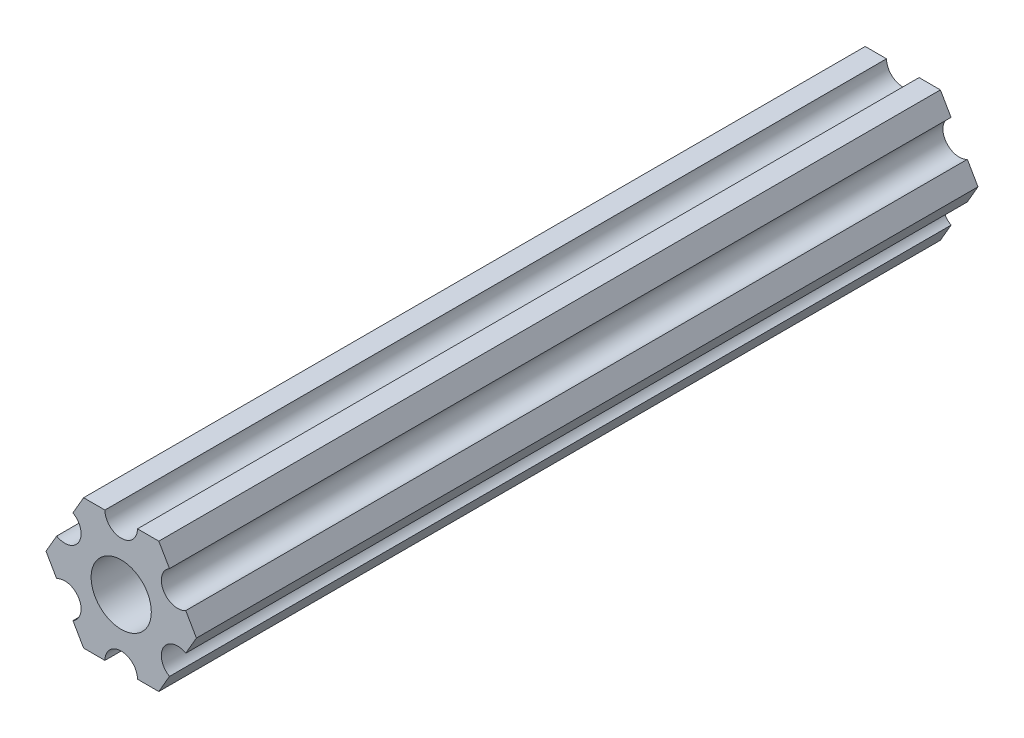
ISO-10303-21;
HEADER;
FILE_DESCRIPTION(('STEP AP214'),'2;1');
FILE_NAME('part.step','',(''),(''),'','','');
FILE_SCHEMA(('AUTOMOTIVE_DESIGN { 1 0 10303 214 1 1 1 1 }'));
ENDSEC;
DATA;
#1=APPLICATION_CONTEXT('core data for automotive mechanical design processes');
#2=APPLICATION_PROTOCOL_DEFINITION('international standard','automotive_design',2000,#1);
#3=PRODUCT_CONTEXT('',#1,'mechanical');
#4=PRODUCT('Part','Part','',(#3));
#5=PRODUCT_RELATED_PRODUCT_CATEGORY('part','',(#4));
#6=PRODUCT_DEFINITION_FORMATION('','',#4);
#7=PRODUCT_DEFINITION_CONTEXT('part definition',#1,'design');
#8=PRODUCT_DEFINITION('design','',#6,#7);
#9=PRODUCT_DEFINITION_SHAPE('','',#8);
#10=(LENGTH_UNIT() NAMED_UNIT(*) SI_UNIT(.MILLI.,.METRE.));
#11=(NAMED_UNIT(*) PLANE_ANGLE_UNIT() SI_UNIT($,.RADIAN.));
#12=(NAMED_UNIT(*) SI_UNIT($,.STERADIAN.) SOLID_ANGLE_UNIT());
#13=UNCERTAINTY_MEASURE_WITH_UNIT(LENGTH_MEASURE(1.E-05),#10,'distance_accuracy_value','');
#14=(GEOMETRIC_REPRESENTATION_CONTEXT(3) GLOBAL_UNCERTAINTY_ASSIGNED_CONTEXT((#13)) GLOBAL_UNIT_ASSIGNED_CONTEXT((#10,
#11,#12)) REPRESENTATION_CONTEXT('',''));
#15=CARTESIAN_POINT('',(0.,0.,0.));
#16=DIRECTION('',(0.,0.,1.));
#17=DIRECTION('',(1.,0.,0.));
#18=AXIS2_PLACEMENT_3D('',#15,#16,#17);
#19=CARTESIAN_POINT('',(5.49926150638083,-3.17499966684068,-76.2));
#20=DIRECTION('',(0.,0.,1.));
#21=DIRECTION('',(1.,0.,0.));
#22=AXIS2_PLACEMENT_3D('',#19,#20,#21);
#23=PLANE('',#22);
#24=CARTESIAN_POINT('',(5.49926150638083,-3.17499966684068,-76.2));
#25=DIRECTION('',(0.,0.,1.));
#26=DIRECTION('',(1.,0.,0.));
#27=AXIS2_PLACEMENT_3D('',#24,#25,#26);
#28=CIRCLE('',#27,1.58750000000001);
#29=CARTESIAN_POINT('',(6.29301142309098,-1.80018429024546,-76.2));
#30=VERTEX_POINT('',#29);
#31=CARTESIAN_POINT('',(4.70551158967068,-4.54981504343589,-76.2));
#32=VERTEX_POINT('',#31);
#33=EDGE_CURVE('E227',#30,#32,#28,.T.);
#34=ORIENTED_EDGE('',*,*,#33,.T.);
#35=DIRECTION('',(-0.499999947533953,-0.866025434075723,0.));
#36=VECTOR('',#35,1.);
#37=CARTESIAN_POINT('',(4.70551158967068,-4.54981504343589,-76.2));
#38=LINE('',#37,#36);
#39=CARTESIAN_POINT('',(3.66617452134693,-6.34999990382519,-76.2));
#40=VERTEX_POINT('',#39);
#41=EDGE_CURVE('E125',#32,#40,#38,.T.);
#42=ORIENTED_EDGE('',*,*,#41,.T.);
#43=DIRECTION('',(-1.,0.,0.));
#44=VECTOR('',#43,1.);
#45=CARTESIAN_POINT('',(3.66617452134693,-6.34999990382519,-76.2));
#46=LINE('',#45,#44);
#47=CARTESIAN_POINT('',(1.58750038469926,-6.34999990382518,-76.2));
#48=VERTEX_POINT('',#47);
#49=EDGE_CURVE('E272',#40,#48,#46,.T.);
#50=ORIENTED_EDGE('',*,*,#49,.T.);
#51=CARTESIAN_POINT('',(3.8469926204343E-07,-6.34999990382519,-76.2));
#52=DIRECTION('',(0.,0.,1.));
#53=DIRECTION('',(1.,0.,0.));
#54=AXIS2_PLACEMENT_3D('',#51,#52,#53);
#55=CIRCLE('',#54,1.5875);
#56=CARTESIAN_POINT('',(-1.58749961530074,-6.34999990382519,-76.2));
#57=VERTEX_POINT('',#56);
#58=EDGE_CURVE('E291',#48,#57,#55,.T.);
#59=ORIENTED_EDGE('',*,*,#58,.T.);
#60=DIRECTION('',(-1.,0.,0.));
#61=VECTOR('',#60,1.);
#62=CARTESIAN_POINT('',(-1.58749961530074,-6.34999990382519,-76.2));
#63=LINE('',#62,#61);
#64=CARTESIAN_POINT('',(-3.66617382465481,-6.34999990382519,-76.2));
#65=VERTEX_POINT('',#64);
#66=EDGE_CURVE('E288',#57,#65,#63,.T.);
#67=ORIENTED_EDGE('',*,*,#66,.T.);
#68=DIRECTION('',(-0.500000006198653,0.866025400205644,0.));
#69=VECTOR('',#68,1.);
#70=CARTESIAN_POINT('',(-3.66617382465481,-6.34999990382519,-76.2));
#71=LINE('',#70,#69);
#72=CARTESIAN_POINT('',(-4.70551094221689,-4.54981523977206,-76.2));
#73=VERTEX_POINT('',#72);
#74=EDGE_CURVE('E290',#65,#73,#71,.T.);
#75=ORIENTED_EDGE('',*,*,#74,.T.);
#76=CARTESIAN_POINT('',(-5.49926095205725,-3.1749999169456,-76.2));
#77=DIRECTION('',(0.,0.,1.));
#78=DIRECTION('',(1.,0.,0.));
#79=AXIS2_PLACEMENT_3D('',#76,#77,#78);
#80=CIRCLE('',#79,1.5875);
#81=CARTESIAN_POINT('',(-6.29301096189761,-1.80018459411914,-76.2));
#82=VERTEX_POINT('',#81);
#83=EDGE_CURVE('E293',#73,#82,#80,.T.);
#84=ORIENTED_EDGE('',*,*,#83,.T.);
#85=DIRECTION('',(-0.500000006198653,0.866025400205645,0.));
#86=VECTOR('',#85,1.);
#87=CARTESIAN_POINT('',(-6.29301096189761,-1.80018459411914,-76.2));
#88=LINE('',#87,#86);
#89=CARTESIAN_POINT('',(-7.33234807945963,6.99338729030344E-08,-76.2));
#90=VERTEX_POINT('',#89);
#91=EDGE_CURVE('E299',#82,#90,#88,.T.);
#92=ORIENTED_EDGE('',*,*,#91,.T.);
#93=DIRECTION('',(0.499999924400249,0.866025447431971,0.));
#94=VECTOR('',#93,1.);
#95=CARTESIAN_POINT('',(-7.33234807945963,6.99338729030344E-08,-76.2));
#96=LINE('',#95,#94);
#97=CARTESIAN_POINT('',(-6.29301121674195,1.80018468525613,-76.2));
#98=VERTEX_POINT('',#97);
#99=EDGE_CURVE('E301',#90,#98,#96,.T.);
#100=ORIENTED_EDGE('',*,*,#99,.T.);
#101=CARTESIAN_POINT('',(-5.49926133675655,3.17500008305439,-76.2));
#102=DIRECTION('',(0.,0.,1.));
#103=DIRECTION('',(1.,0.,0.));
#104=AXIS2_PLACEMENT_3D('',#101,#102,#103);
#105=CIRCLE('',#104,1.5875);
#106=CARTESIAN_POINT('',(-4.70551145677116,4.54981548085265,-76.2));
#107=VERTEX_POINT('',#106);
#108=EDGE_CURVE('E303',#98,#107,#105,.T.);
#109=ORIENTED_EDGE('',*,*,#108,.T.);
#110=DIRECTION('',(0.499999924400249,0.866025447431971,0.));
#111=VECTOR('',#110,1.);
#112=CARTESIAN_POINT('',(-4.70551145677116,4.54981548085265,-76.2));
#113=LINE('',#112,#111);
#114=CARTESIAN_POINT('',(-3.66617452134701,6.35000022210623,-76.2));
#115=VERTEX_POINT('',#114);
#116=EDGE_CURVE('E305',#107,#115,#113,.T.);
#117=ORIENTED_EDGE('',*,*,#116,.T.);
#118=DIRECTION('',(1.,0.,0.));
#119=VECTOR('',#118,1.);
#120=CARTESIAN_POINT('',(-3.66617452134701,6.35000022210623,-76.2));
#121=LINE('',#120,#119);
#122=CARTESIAN_POINT('',(-1.58750038469935,6.35000022210623,-76.2));
#123=VERTEX_POINT('',#122);
#124=EDGE_CURVE('E307',#115,#123,#121,.T.);
#125=ORIENTED_EDGE('',*,*,#124,.T.);
#126=CARTESIAN_POINT('',(-3.84699344941095E-07,6.35000022210623,-76.2));
#127=DIRECTION('',(0.,0.,1.));
#128=DIRECTION('',(1.,0.,0.));
#129=AXIS2_PLACEMENT_3D('',#126,#127,#128);
#130=CIRCLE('',#129,1.5875);
#131=CARTESIAN_POINT('',(1.58749961530066,6.35000022210623,-76.2));
#132=VERTEX_POINT('',#131);
#133=EDGE_CURVE('E309',#123,#132,#130,.T.);
#134=ORIENTED_EDGE('',*,*,#133,.T.);
#135=DIRECTION('',(1.,0.,0.));
#136=VECTOR('',#135,1.);
#137=CARTESIAN_POINT('',(1.58749961530066,6.35000022210623,-76.2));
#138=LINE('',#137,#136);
#139=CARTESIAN_POINT('',(3.66617382465472,6.35000022210622,-76.2));
#140=VERTEX_POINT('',#139);
#141=EDGE_CURVE('E311',#132,#140,#138,.T.);
#142=ORIENTED_EDGE('',*,*,#141,.T.);
#143=DIRECTION('',(0.500000052466056,-0.866025373493145,0.));
#144=VECTOR('',#143,1.);
#145=CARTESIAN_POINT('',(3.66617382465472,6.35000022210622,-76.2));
#146=LINE('',#145,#144);
#147=CARTESIAN_POINT('',(4.70551103839166,4.54981561357968,-76.2));
#148=VERTEX_POINT('',#147);
#149=EDGE_CURVE('E174',#140,#148,#146,.T.);
#150=ORIENTED_EDGE('',*,*,#149,.T.);
#151=CARTESIAN_POINT('',(5.49926112168152,3.17500033315931,-76.2));
#152=DIRECTION('',(0.,0.,1.));
#153=DIRECTION('',(1.,0.,0.));
#154=AXIS2_PLACEMENT_3D('',#151,#152,#153);
#155=CIRCLE('',#154,1.5875);
#156=CARTESIAN_POINT('',(6.29301120497139,1.80018505273895,-76.2));
#157=VERTEX_POINT('',#156);
#158=EDGE_CURVE('E168',#148,#157,#155,.T.);
#159=ORIENTED_EDGE('',*,*,#158,.T.);
#160=DIRECTION('',(0.500000052466056,-0.866025373493145,0.));
#161=VECTOR('',#160,1.);
#162=CARTESIAN_POINT('',(6.29301120497139,1.80018505273895,-76.2));
#163=LINE('',#162,#161);
#164=CARTESIAN_POINT('',(7.33234841870826,4.44212518856872E-07,-76.2));
#165=VERTEX_POINT('',#164);
#166=EDGE_CURVE('E172',#157,#165,#163,.T.);
#167=ORIENTED_EDGE('',*,*,#166,.T.);
#168=DIRECTION('',(-0.499999947533953,-0.866025434075723,0.));
#169=VECTOR('',#168,1.);
#170=CARTESIAN_POINT('',(7.33234841870826,4.44212518856872E-07,-76.2));
#171=LINE('',#170,#169);
#172=EDGE_CURVE('E52',#165,#30,#171,.T.);
#173=ORIENTED_EDGE('',*,*,#172,.T.);
#174=EDGE_LOOP('',(#34,#42,#50,#59,#67,#75,#84,#92,#100,#109,#117,#125,#134,#142,#150,#159,#167,#173));
#175=FACE_BOUND('',#174,.T.);
#176=CARTESIAN_POINT('',(0.,0.,-76.2));
#177=DIRECTION('',(0.,0.,-1.));
#178=DIRECTION('',(1.,0.,0.));
#179=AXIS2_PLACEMENT_3D('',#176,#177,#178);
#180=CIRCLE('',#179,2.9337);
#181=CARTESIAN_POINT('',(2.9337,0.,-76.2));
#182=VERTEX_POINT('',#181);
#183=EDGE_CURVE('E196',#182,#182,#180,.T.);
#184=ORIENTED_EDGE('',*,*,#183,.F.);
#185=EDGE_LOOP('',(#184));
#186=FACE_BOUND('',#185,.T.);
#187=ADVANCED_FACE('F35',(#175,#186),#23,.F.);
#188=CARTESIAN_POINT('',(5.49926150638083,-3.17499966684068,0.));
#189=DIRECTION('',(0.,0.,1.));
#190=DIRECTION('',(1.,0.,0.));
#191=AXIS2_PLACEMENT_3D('',#188,#189,#190);
#192=PLANE('',#191);
#193=CARTESIAN_POINT('',(5.49926150638083,-3.17499966684068,0.));
#194=DIRECTION('',(0.,0.,1.));
#195=DIRECTION('',(1.,0.,0.));
#196=AXIS2_PLACEMENT_3D('',#193,#194,#195);
#197=CIRCLE('',#196,1.58750000000001);
#198=CARTESIAN_POINT('',(6.29301142309098,-1.80018429024546,0.));
#199=VERTEX_POINT('',#198);
#200=CARTESIAN_POINT('',(4.70551158967068,-4.54981504343589,0.));
#201=VERTEX_POINT('',#200);
#202=EDGE_CURVE('E192',#199,#201,#197,.T.);
#203=ORIENTED_EDGE('',*,*,#202,.F.);
#204=DIRECTION('',(-0.499999947533953,-0.866025434075723,0.));
#205=VECTOR('',#204,1.);
#206=CARTESIAN_POINT('',(7.33234841870826,4.44212518856872E-07,0.));
#207=LINE('',#206,#205);
#208=CARTESIAN_POINT('',(7.33234841870826,4.44212518856872E-07,0.));
#209=VERTEX_POINT('',#208);
#210=EDGE_CURVE('E117',#209,#199,#207,.T.);
#211=ORIENTED_EDGE('',*,*,#210,.F.);
#212=DIRECTION('',(0.500000052466056,-0.866025373493145,0.));
#213=VECTOR('',#212,1.);
#214=CARTESIAN_POINT('',(6.29301120497139,1.80018505273895,0.));
#215=LINE('',#214,#213);
#216=CARTESIAN_POINT('',(6.29301120497139,1.80018505273895,0.));
#217=VERTEX_POINT('',#216);
#218=EDGE_CURVE('E111',#217,#209,#215,.T.);
#219=ORIENTED_EDGE('',*,*,#218,.F.);
#220=CARTESIAN_POINT('',(5.49926112168152,3.17500033315931,0.));
#221=DIRECTION('',(0.,0.,1.));
#222=DIRECTION('',(1.,0.,0.));
#223=AXIS2_PLACEMENT_3D('',#220,#221,#222);
#224=CIRCLE('',#223,1.5875);
#225=CARTESIAN_POINT('',(4.70551103839166,4.54981561357968,0.));
#226=VERTEX_POINT('',#225);
#227=EDGE_CURVE('E182',#226,#217,#224,.T.);
#228=ORIENTED_EDGE('',*,*,#227,.F.);
#229=DIRECTION('',(0.500000052466056,-0.866025373493145,0.));
#230=VECTOR('',#229,1.);
#231=CARTESIAN_POINT('',(3.66617382465472,6.35000022210622,0.));
#232=LINE('',#231,#230);
#233=CARTESIAN_POINT('',(3.66617382465472,6.35000022210622,0.));
#234=VERTEX_POINT('',#233);
#235=EDGE_CURVE('E222',#234,#226,#232,.T.);
#236=ORIENTED_EDGE('',*,*,#235,.F.);
#237=DIRECTION('',(1.,0.,0.));
#238=VECTOR('',#237,1.);
#239=CARTESIAN_POINT('',(1.58749961530066,6.35000022210623,0.));
#240=LINE('',#239,#238);
#241=CARTESIAN_POINT('',(1.58749961530066,6.35000022210623,0.));
#242=VERTEX_POINT('',#241);
#243=EDGE_CURVE('E220',#242,#234,#240,.T.);
#244=ORIENTED_EDGE('',*,*,#243,.F.);
#245=CARTESIAN_POINT('',(-3.84699344941095E-07,6.35000022210623,0.));
#246=DIRECTION('',(0.,0.,1.));
#247=DIRECTION('',(1.,0.,0.));
#248=AXIS2_PLACEMENT_3D('',#245,#246,#247);
#249=CIRCLE('',#248,1.5875);
#250=CARTESIAN_POINT('',(-1.58750038469935,6.35000022210623,0.));
#251=VERTEX_POINT('',#250);
#252=EDGE_CURVE('E218',#251,#242,#249,.T.);
#253=ORIENTED_EDGE('',*,*,#252,.F.);
#254=DIRECTION('',(1.,0.,0.));
#255=VECTOR('',#254,1.);
#256=CARTESIAN_POINT('',(-3.66617452134701,6.35000022210623,0.));
#257=LINE('',#256,#255);
#258=CARTESIAN_POINT('',(-3.66617452134701,6.35000022210623,0.));
#259=VERTEX_POINT('',#258);
#260=EDGE_CURVE('E216',#259,#251,#257,.T.);
#261=ORIENTED_EDGE('',*,*,#260,.F.);
#262=DIRECTION('',(0.499999924400249,0.866025447431971,0.));
#263=VECTOR('',#262,1.);
#264=CARTESIAN_POINT('',(-4.70551145677116,4.54981548085265,0.));
#265=LINE('',#264,#263);
#266=CARTESIAN_POINT('',(-4.70551145677116,4.54981548085265,0.));
#267=VERTEX_POINT('',#266);
#268=EDGE_CURVE('E214',#267,#259,#265,.T.);
#269=ORIENTED_EDGE('',*,*,#268,.F.);
#270=CARTESIAN_POINT('',(-5.49926133675655,3.17500008305439,0.));
#271=DIRECTION('',(0.,0.,1.));
#272=DIRECTION('',(1.,0.,0.));
#273=AXIS2_PLACEMENT_3D('',#270,#271,#272);
#274=CIRCLE('',#273,1.5875);
#275=CARTESIAN_POINT('',(-6.29301121674195,1.80018468525613,0.));
#276=VERTEX_POINT('',#275);
#277=EDGE_CURVE('E212',#276,#267,#274,.T.);
#278=ORIENTED_EDGE('',*,*,#277,.F.);
#279=DIRECTION('',(0.499999924400249,0.866025447431971,0.));
#280=VECTOR('',#279,1.);
#281=CARTESIAN_POINT('',(-7.33234807945963,6.99338729030344E-08,0.));
#282=LINE('',#281,#280);
#283=CARTESIAN_POINT('',(-7.33234807945963,6.99338729030344E-08,0.));
#284=VERTEX_POINT('',#283);
#285=EDGE_CURVE('E210',#284,#276,#282,.T.);
#286=ORIENTED_EDGE('',*,*,#285,.F.);
#287=DIRECTION('',(-0.500000006198653,0.866025400205645,0.));
#288=VECTOR('',#287,1.);
#289=CARTESIAN_POINT('',(-6.29301096189761,-1.80018459411914,0.));
#290=LINE('',#289,#288);
#291=CARTESIAN_POINT('',(-6.29301096189761,-1.80018459411914,0.));
#292=VERTEX_POINT('',#291);
#293=EDGE_CURVE('E208',#292,#284,#290,.T.);
#294=ORIENTED_EDGE('',*,*,#293,.F.);
#295=CARTESIAN_POINT('',(-5.49926095205725,-3.1749999169456,0.));
#296=DIRECTION('',(0.,0.,1.));
#297=DIRECTION('',(1.,0.,0.));
#298=AXIS2_PLACEMENT_3D('',#295,#296,#297);
#299=CIRCLE('',#298,1.5875);
#300=CARTESIAN_POINT('',(-4.70551094221689,-4.54981523977206,0.));
#301=VERTEX_POINT('',#300);
#302=EDGE_CURVE('E206',#301,#292,#299,.T.);
#303=ORIENTED_EDGE('',*,*,#302,.F.);
#304=DIRECTION('',(-0.500000006198653,0.866025400205644,0.));
#305=VECTOR('',#304,1.);
#306=CARTESIAN_POINT('',(-3.66617382465481,-6.34999990382519,0.));
#307=LINE('',#306,#305);
#308=CARTESIAN_POINT('',(-3.66617382465481,-6.34999990382519,0.));
#309=VERTEX_POINT('',#308);
#310=EDGE_CURVE('E204',#309,#301,#307,.T.);
#311=ORIENTED_EDGE('',*,*,#310,.F.);
#312=DIRECTION('',(-1.,0.,0.));
#313=VECTOR('',#312,1.);
#314=CARTESIAN_POINT('',(-1.58749961530074,-6.34999990382519,0.));
#315=LINE('',#314,#313);
#316=CARTESIAN_POINT('',(-1.58749961530074,-6.34999990382519,0.));
#317=VERTEX_POINT('',#316);
#318=EDGE_CURVE('E202',#317,#309,#315,.T.);
#319=ORIENTED_EDGE('',*,*,#318,.F.);
#320=CARTESIAN_POINT('',(3.8469926204343E-07,-6.34999990382519,0.));
#321=DIRECTION('',(0.,0.,1.));
#322=DIRECTION('',(1.,0.,0.));
#323=AXIS2_PLACEMENT_3D('',#320,#321,#322);
#324=CIRCLE('',#323,1.5875);
#325=CARTESIAN_POINT('',(1.58750038469926,-6.34999990382518,0.));
#326=VERTEX_POINT('',#325);
#327=EDGE_CURVE('E200',#326,#317,#324,.T.);
#328=ORIENTED_EDGE('',*,*,#327,.F.);
#329=DIRECTION('',(-1.,0.,0.));
#330=VECTOR('',#329,1.);
#331=CARTESIAN_POINT('',(3.66617452134693,-6.34999990382519,0.));
#332=LINE('',#331,#330);
#333=CARTESIAN_POINT('',(3.66617452134693,-6.34999990382519,0.));
#334=VERTEX_POINT('',#333);
#335=EDGE_CURVE('E198',#334,#326,#332,.T.);
#336=ORIENTED_EDGE('',*,*,#335,.F.);
#337=DIRECTION('',(-0.499999947533953,-0.866025434075723,0.));
#338=VECTOR('',#337,1.);
#339=CARTESIAN_POINT('',(4.70551158967068,-4.54981504343589,0.));
#340=LINE('',#339,#338);
#341=EDGE_CURVE('E195',#201,#334,#340,.T.);
#342=ORIENTED_EDGE('',*,*,#341,.F.);
#343=EDGE_LOOP('',(#203,#211,#219,#228,#236,#244,#253,#261,#269,#278,#286,#294,#303,#311,#319,
#328,#336,#342));
#344=FACE_BOUND('',#343,.T.);
#345=CARTESIAN_POINT('',(0.,0.,0.));
#346=DIRECTION('',(0.,0.,-1.));
#347=DIRECTION('',(1.,0.,0.));
#348=AXIS2_PLACEMENT_3D('',#345,#346,#347);
#349=CIRCLE('',#348,2.9337);
#350=CARTESIAN_POINT('',(2.9337,0.,0.));
#351=VERTEX_POINT('',#350);
#352=EDGE_CURVE('E536',#351,#351,#349,.T.);
#353=ORIENTED_EDGE('',*,*,#352,.T.);
#354=EDGE_LOOP('',(#353));
#355=FACE_BOUND('',#354,.T.);
#356=ADVANCED_FACE('F276',(#344,#355),#192,.T.);
#357=CARTESIAN_POINT('',(5.49926150638083,-3.17499966684068,-76.2));
#358=DIRECTION('',(0.,0.,1.));
#359=DIRECTION('',(1.,0.,0.));
#360=AXIS2_PLACEMENT_3D('',#357,#358,#359);
#361=CYLINDRICAL_SURFACE('',#360,1.58750000000001);
#362=ORIENTED_EDGE('',*,*,#202,.T.);
#363=DIRECTION('',(0.,0.,1.));
#364=VECTOR('',#363,1.);
#365=CARTESIAN_POINT('',(4.70551158967068,-4.54981504343589,-76.2));
#366=LINE('',#365,#364);
#367=EDGE_CURVE('E11',#32,#201,#366,.T.);
#368=ORIENTED_EDGE('',*,*,#367,.F.);
#369=ORIENTED_EDGE('',*,*,#33,.F.);
#370=DIRECTION('',(0.,0.,1.));
#371=VECTOR('',#370,1.);
#372=CARTESIAN_POINT('',(6.29301142309098,-1.80018429024546,-76.2));
#373=LINE('',#372,#371);
#374=EDGE_CURVE('E188',#30,#199,#373,.T.);
#375=ORIENTED_EDGE('',*,*,#374,.T.);
#376=EDGE_LOOP('',(#362,#368,#369,#375));
#377=FACE_BOUND('',#376,.T.);
#378=ADVANCED_FACE('F37',(#377),#361,.F.);
#379=CARTESIAN_POINT('',(4.70551158967068,-4.54981504343589,-76.2));
#380=DIRECTION('',(-0.866025434075723,0.499999947533953,0.));
#381=DIRECTION('',(-0.499999947533953,-0.866025434075723,0.));
#382=AXIS2_PLACEMENT_3D('',#379,#380,#381);
#383=PLANE('',#382);
#384=ORIENTED_EDGE('',*,*,#341,.T.);
#385=DIRECTION('',(0.,0.,1.));
#386=VECTOR('',#385,1.);
#387=CARTESIAN_POINT('',(3.66617452134693,-6.34999990382519,-76.2));
#388=LINE('',#387,#386);
#389=EDGE_CURVE('E44',#40,#334,#388,.T.);
#390=ORIENTED_EDGE('',*,*,#389,.F.);
#391=ORIENTED_EDGE('',*,*,#41,.F.);
#392=ORIENTED_EDGE('',*,*,#367,.T.);
#393=EDGE_LOOP('',(#384,#390,#391,#392));
#394=FACE_BOUND('',#393,.T.);
#395=ADVANCED_FACE('F345',(#394),#383,.F.);
#396=CARTESIAN_POINT('',(3.66617452134693,-6.34999990382519,-76.2));
#397=DIRECTION('',(0.,1.,0.));
#398=DIRECTION('',(-1.,0.,0.));
#399=AXIS2_PLACEMENT_3D('',#396,#397,#398);
#400=PLANE('',#399);
#401=ORIENTED_EDGE('',*,*,#335,.T.);
#402=DIRECTION('',(0.,0.,1.));
#403=VECTOR('',#402,1.);
#404=CARTESIAN_POINT('',(1.58750038469926,-6.34999990382518,-76.2));
#405=LINE('',#404,#403);
#406=EDGE_CURVE('E264',#48,#326,#405,.T.);
#407=ORIENTED_EDGE('',*,*,#406,.F.);
#408=ORIENTED_EDGE('',*,*,#49,.F.);
#409=ORIENTED_EDGE('',*,*,#389,.T.);
#410=EDGE_LOOP('',(#401,#407,#408,#409));
#411=FACE_BOUND('',#410,.T.);
#412=ADVANCED_FACE('F270',(#411),#400,.F.);
#413=CARTESIAN_POINT('',(3.8469926204343E-07,-6.34999990382519,-76.2));
#414=DIRECTION('',(0.,0.,1.));
#415=DIRECTION('',(1.,0.,0.));
#416=AXIS2_PLACEMENT_3D('',#413,#414,#415);
#417=CYLINDRICAL_SURFACE('',#416,1.5875);
#418=ORIENTED_EDGE('',*,*,#327,.T.);
#419=DIRECTION('',(0.,0.,1.));
#420=VECTOR('',#419,1.);
#421=CARTESIAN_POINT('',(-1.58749961530074,-6.34999990382519,-76.2));
#422=LINE('',#421,#420);
#423=EDGE_CURVE('E261',#57,#317,#422,.T.);
#424=ORIENTED_EDGE('',*,*,#423,.F.);
#425=ORIENTED_EDGE('',*,*,#58,.F.);
#426=ORIENTED_EDGE('',*,*,#406,.T.);
#427=EDGE_LOOP('',(#418,#424,#425,#426));
#428=FACE_BOUND('',#427,.T.);
#429=ADVANCED_FACE('F282',(#428),#417,.F.);
#430=CARTESIAN_POINT('',(-1.58749961530074,-6.34999990382519,-76.2));
#431=DIRECTION('',(0.,1.,0.));
#432=DIRECTION('',(-1.,0.,0.));
#433=AXIS2_PLACEMENT_3D('',#430,#431,#432);
#434=PLANE('',#433);
#435=ORIENTED_EDGE('',*,*,#318,.T.);
#436=DIRECTION('',(0.,0.,1.));
#437=VECTOR('',#436,1.);
#438=CARTESIAN_POINT('',(-3.66617382465481,-6.34999990382519,-76.2));
#439=LINE('',#438,#437);
#440=EDGE_CURVE('E258',#65,#309,#439,.T.);
#441=ORIENTED_EDGE('',*,*,#440,.F.);
#442=ORIENTED_EDGE('',*,*,#66,.F.);
#443=ORIENTED_EDGE('',*,*,#423,.T.);
#444=EDGE_LOOP('',(#435,#441,#442,#443));
#445=FACE_BOUND('',#444,.T.);
#446=ADVANCED_FACE('F286',(#445),#434,.F.);
#447=CARTESIAN_POINT('',(-3.66617382465481,-6.34999990382519,-76.2));
#448=DIRECTION('',(0.866025400205645,0.500000006198653,0.));
#449=DIRECTION('',(-0.500000006198653,0.866025400205645,0.));
#450=AXIS2_PLACEMENT_3D('',#447,#448,#449);
#451=PLANE('',#450);
#452=ORIENTED_EDGE('',*,*,#310,.T.);
#453=DIRECTION('',(0.,0.,1.));
#454=VECTOR('',#453,1.);
#455=CARTESIAN_POINT('',(-4.70551094221689,-4.54981523977206,-76.2));
#456=LINE('',#455,#454);
#457=EDGE_CURVE('E255',#73,#301,#456,.T.);
#458=ORIENTED_EDGE('',*,*,#457,.F.);
#459=ORIENTED_EDGE('',*,*,#74,.F.);
#460=ORIENTED_EDGE('',*,*,#440,.T.);
#461=EDGE_LOOP('',(#452,#458,#459,#460));
#462=FACE_BOUND('',#461,.T.);
#463=ADVANCED_FACE('F358',(#462),#451,.F.);
#464=CARTESIAN_POINT('',(-5.49926095205725,-3.1749999169456,-76.2));
#465=DIRECTION('',(0.,0.,1.));
#466=DIRECTION('',(1.,0.,0.));
#467=AXIS2_PLACEMENT_3D('',#464,#465,#466);
#468=CYLINDRICAL_SURFACE('',#467,1.5875);
#469=ORIENTED_EDGE('',*,*,#302,.T.);
#470=DIRECTION('',(0.,0.,1.));
#471=VECTOR('',#470,1.);
#472=CARTESIAN_POINT('',(-6.29301096189761,-1.80018459411914,-76.2));
#473=LINE('',#472,#471);
#474=EDGE_CURVE('E252',#82,#292,#473,.T.);
#475=ORIENTED_EDGE('',*,*,#474,.F.);
#476=ORIENTED_EDGE('',*,*,#83,.F.);
#477=ORIENTED_EDGE('',*,*,#457,.T.);
#478=EDGE_LOOP('',(#469,#475,#476,#477));
#479=FACE_BOUND('',#478,.T.);
#480=ADVANCED_FACE('F361',(#479),#468,.F.);
#481=CARTESIAN_POINT('',(-6.29301096189761,-1.80018459411914,-76.2));
#482=DIRECTION('',(0.866025400205645,0.500000006198653,0.));
#483=DIRECTION('',(-0.500000006198653,0.866025400205645,0.));
#484=AXIS2_PLACEMENT_3D('',#481,#482,#483);
#485=PLANE('',#484);
#486=ORIENTED_EDGE('',*,*,#293,.T.);
#487=DIRECTION('',(0.,0.,1.));
#488=VECTOR('',#487,1.);
#489=CARTESIAN_POINT('',(-7.33234807945963,6.99338729030344E-08,-76.2));
#490=LINE('',#489,#488);
#491=EDGE_CURVE('E249',#90,#284,#490,.T.);
#492=ORIENTED_EDGE('',*,*,#491,.F.);
#493=ORIENTED_EDGE('',*,*,#91,.F.);
#494=ORIENTED_EDGE('',*,*,#474,.T.);
#495=EDGE_LOOP('',(#486,#492,#493,#494));
#496=FACE_BOUND('',#495,.T.);
#497=ADVANCED_FACE('F365',(#496),#485,.F.);
#498=CARTESIAN_POINT('',(-7.33234807945963,6.99338729030344E-08,-76.2));
#499=DIRECTION('',(0.866025447431971,-0.499999924400249,0.));
#500=DIRECTION('',(0.499999924400249,0.866025447431971,0.));
#501=AXIS2_PLACEMENT_3D('',#498,#499,#500);
#502=PLANE('',#501);
#503=ORIENTED_EDGE('',*,*,#285,.T.);
#504=DIRECTION('',(0.,0.,1.));
#505=VECTOR('',#504,1.);
#506=CARTESIAN_POINT('',(-6.29301121674195,1.80018468525613,-76.2));
#507=LINE('',#506,#505);
#508=EDGE_CURVE('E246',#98,#276,#507,.T.);
#509=ORIENTED_EDGE('',*,*,#508,.F.);
#510=ORIENTED_EDGE('',*,*,#99,.F.);
#511=ORIENTED_EDGE('',*,*,#491,.T.);
#512=EDGE_LOOP('',(#503,#509,#510,#511));
#513=FACE_BOUND('',#512,.T.);
#514=ADVANCED_FACE('F369',(#513),#502,.F.);
#515=CARTESIAN_POINT('',(-5.49926133675655,3.17500008305439,-76.2));
#516=DIRECTION('',(0.,0.,1.));
#517=DIRECTION('',(1.,0.,0.));
#518=AXIS2_PLACEMENT_3D('',#515,#516,#517);
#519=CYLINDRICAL_SURFACE('',#518,1.5875);
#520=ORIENTED_EDGE('',*,*,#277,.T.);
#521=DIRECTION('',(0.,0.,1.));
#522=VECTOR('',#521,1.);
#523=CARTESIAN_POINT('',(-4.70551145677116,4.54981548085265,-76.2));
#524=LINE('',#523,#522);
#525=EDGE_CURVE('E243',#107,#267,#524,.T.);
#526=ORIENTED_EDGE('',*,*,#525,.F.);
#527=ORIENTED_EDGE('',*,*,#108,.F.);
#528=ORIENTED_EDGE('',*,*,#508,.T.);
#529=EDGE_LOOP('',(#520,#526,#527,#528));
#530=FACE_BOUND('',#529,.T.);
#531=ADVANCED_FACE('F373',(#530),#519,.F.);
#532=CARTESIAN_POINT('',(-4.70551145677116,4.54981548085265,-76.2));
#533=DIRECTION('',(0.866025447431971,-0.499999924400249,0.));
#534=DIRECTION('',(0.499999924400249,0.866025447431971,0.));
#535=AXIS2_PLACEMENT_3D('',#532,#533,#534);
#536=PLANE('',#535);
#537=ORIENTED_EDGE('',*,*,#268,.T.);
#538=DIRECTION('',(0.,0.,1.));
#539=VECTOR('',#538,1.);
#540=CARTESIAN_POINT('',(-3.66617452134701,6.35000022210623,-76.2));
#541=LINE('',#540,#539);
#542=EDGE_CURVE('E240',#115,#259,#541,.T.);
#543=ORIENTED_EDGE('',*,*,#542,.F.);
#544=ORIENTED_EDGE('',*,*,#116,.F.);
#545=ORIENTED_EDGE('',*,*,#525,.T.);
#546=EDGE_LOOP('',(#537,#543,#544,#545));
#547=FACE_BOUND('',#546,.T.);
#548=ADVANCED_FACE('F377',(#547),#536,.F.);
#549=CARTESIAN_POINT('',(-3.66617452134701,6.35000022210623,-76.2));
#550=DIRECTION('',(0.,-1.,0.));
#551=DIRECTION('',(0.,0.,-1.));
#552=AXIS2_PLACEMENT_3D('',#549,#550,#551);
#553=PLANE('',#552);
#554=ORIENTED_EDGE('',*,*,#260,.T.);
#555=DIRECTION('',(0.,0.,1.));
#556=VECTOR('',#555,1.);
#557=CARTESIAN_POINT('',(-1.58750038469935,6.35000022210623,-76.2));
#558=LINE('',#557,#556);
#559=EDGE_CURVE('E237',#123,#251,#558,.T.);
#560=ORIENTED_EDGE('',*,*,#559,.F.);
#561=ORIENTED_EDGE('',*,*,#124,.F.);
#562=ORIENTED_EDGE('',*,*,#542,.T.);
#563=EDGE_LOOP('',(#554,#560,#561,#562));
#564=FACE_BOUND('',#563,.T.);
#565=ADVANCED_FACE('F381',(#564),#553,.F.);
#566=CARTESIAN_POINT('',(-3.84699344941095E-07,6.35000022210623,-76.2));
#567=DIRECTION('',(0.,0.,1.));
#568=DIRECTION('',(1.,0.,0.));
#569=AXIS2_PLACEMENT_3D('',#566,#567,#568);
#570=CYLINDRICAL_SURFACE('',#569,1.5875);
#571=ORIENTED_EDGE('',*,*,#252,.T.);
#572=DIRECTION('',(0.,0.,1.));
#573=VECTOR('',#572,1.);
#574=CARTESIAN_POINT('',(1.58749961530066,6.35000022210623,-76.2));
#575=LINE('',#574,#573);
#576=EDGE_CURVE('E234',#132,#242,#575,.T.);
#577=ORIENTED_EDGE('',*,*,#576,.F.);
#578=ORIENTED_EDGE('',*,*,#133,.F.);
#579=ORIENTED_EDGE('',*,*,#559,.T.);
#580=EDGE_LOOP('',(#571,#577,#578,#579));
#581=FACE_BOUND('',#580,.T.);
#582=ADVANCED_FACE('F385',(#581),#570,.F.);
#583=CARTESIAN_POINT('',(1.58749961530066,6.35000022210623,-76.2));
#584=DIRECTION('',(0.,-1.,0.));
#585=DIRECTION('',(1.,0.,0.));
#586=AXIS2_PLACEMENT_3D('',#583,#584,#585);
#587=PLANE('',#586);
#588=ORIENTED_EDGE('',*,*,#243,.T.);
#589=DIRECTION('',(0.,0.,1.));
#590=VECTOR('',#589,1.);
#591=CARTESIAN_POINT('',(3.66617382465472,6.35000022210622,-76.2));
#592=LINE('',#591,#590);
#593=EDGE_CURVE('E231',#140,#234,#592,.T.);
#594=ORIENTED_EDGE('',*,*,#593,.F.);
#595=ORIENTED_EDGE('',*,*,#141,.F.);
#596=ORIENTED_EDGE('',*,*,#576,.T.);
#597=EDGE_LOOP('',(#588,#594,#595,#596));
#598=FACE_BOUND('',#597,.T.);
#599=ADVANCED_FACE('F317',(#598),#587,.F.);
#600=CARTESIAN_POINT('',(3.66617382465472,6.35000022210622,-76.2));
#601=DIRECTION('',(-0.866025373493145,-0.500000052466056,0.));
#602=DIRECTION('',(0.500000052466056,-0.866025373493145,0.));
#603=AXIS2_PLACEMENT_3D('',#600,#601,#602);
#604=PLANE('',#603);
#605=ORIENTED_EDGE('',*,*,#235,.T.);
#606=DIRECTION('',(0.,0.,1.));
#607=VECTOR('',#606,1.);
#608=CARTESIAN_POINT('',(4.70551103839166,4.54981561357968,-76.2));
#609=LINE('',#608,#607);
#610=EDGE_CURVE('E183',#148,#226,#609,.T.);
#611=ORIENTED_EDGE('',*,*,#610,.F.);
#612=ORIENTED_EDGE('',*,*,#149,.F.);
#613=ORIENTED_EDGE('',*,*,#593,.T.);
#614=EDGE_LOOP('',(#605,#611,#612,#613));
#615=FACE_BOUND('',#614,.T.);
#616=ADVANCED_FACE('F321',(#615),#604,.F.);
#617=CARTESIAN_POINT('',(5.49926112168152,3.17500033315931,-76.2));
#618=DIRECTION('',(0.,0.,1.));
#619=DIRECTION('',(1.,0.,0.));
#620=AXIS2_PLACEMENT_3D('',#617,#618,#619);
#621=CYLINDRICAL_SURFACE('',#620,1.5875);
#622=ORIENTED_EDGE('',*,*,#227,.T.);
#623=DIRECTION('',(0.,0.,1.));
#624=VECTOR('',#623,1.);
#625=CARTESIAN_POINT('',(6.29301120497139,1.80018505273895,-76.2));
#626=LINE('',#625,#624);
#627=EDGE_CURVE('E179',#157,#217,#626,.T.);
#628=ORIENTED_EDGE('',*,*,#627,.F.);
#629=ORIENTED_EDGE('',*,*,#158,.F.);
#630=ORIENTED_EDGE('',*,*,#610,.T.);
#631=EDGE_LOOP('',(#622,#628,#629,#630));
#632=FACE_BOUND('',#631,.T.);
#633=ADVANCED_FACE('F180',(#632),#621,.F.);
#634=CARTESIAN_POINT('',(6.29301120497139,1.80018505273895,-76.2));
#635=DIRECTION('',(-0.866025373493145,-0.500000052466056,0.));
#636=DIRECTION('',(0.500000052466056,-0.866025373493145,0.));
#637=AXIS2_PLACEMENT_3D('',#634,#635,#636);
#638=PLANE('',#637);
#639=ORIENTED_EDGE('',*,*,#218,.T.);
#640=DIRECTION('',(0.,0.,1.));
#641=VECTOR('',#640,1.);
#642=CARTESIAN_POINT('',(7.33234841870826,4.44212518856872E-07,-76.2));
#643=LINE('',#642,#641);
#644=EDGE_CURVE('E184',#165,#209,#643,.T.);
#645=ORIENTED_EDGE('',*,*,#644,.F.);
#646=ORIENTED_EDGE('',*,*,#166,.F.);
#647=ORIENTED_EDGE('',*,*,#627,.T.);
#648=EDGE_LOOP('',(#639,#645,#646,#647));
#649=FACE_BOUND('',#648,.T.);
#650=ADVANCED_FACE('F186',(#649),#638,.F.);
#651=CARTESIAN_POINT('',(7.33234841870826,4.44212518856872E-07,-76.2));
#652=DIRECTION('',(-0.866025434075723,0.499999947533953,0.));
#653=DIRECTION('',(-0.499999947533953,-0.866025434075723,0.));
#654=AXIS2_PLACEMENT_3D('',#651,#652,#653);
#655=PLANE('',#654);
#656=ORIENTED_EDGE('',*,*,#210,.T.);
#657=ORIENTED_EDGE('',*,*,#374,.F.);
#658=ORIENTED_EDGE('',*,*,#172,.F.);
#659=ORIENTED_EDGE('',*,*,#644,.T.);
#660=EDGE_LOOP('',(#656,#657,#658,#659));
#661=FACE_BOUND('',#660,.T.);
#662=ADVANCED_FACE('F325',(#661),#655,.F.);
#663=CARTESIAN_POINT('',(0.,0.,-76.2));
#664=DIRECTION('',(0.,0.,1.));
#665=DIRECTION('',(1.,0.,0.));
#666=AXIS2_PLACEMENT_3D('',#663,#664,#665);
#667=CYLINDRICAL_SURFACE('',#666,2.9337);
#668=CARTESIAN_POINT('',(2.9337,0.,-76.2));
#669=CARTESIAN_POINT('',(2.9337,0.,-75.40625));
#670=CARTESIAN_POINT('',(2.9337,0.,-74.6125));
#671=CARTESIAN_POINT('',(2.9337,0.,-73.025));
#672=CARTESIAN_POINT('',(2.9337,0.,-72.23125));
#673=CARTESIAN_POINT('',(2.9337,0.,-70.64375));
#674=CARTESIAN_POINT('',(2.9337,0.,-69.85));
#675=CARTESIAN_POINT('',(2.9337,0.,-68.2625));
#676=CARTESIAN_POINT('',(2.9337,0.,-67.46875));
#677=CARTESIAN_POINT('',(2.9337,0.,-65.88125));
#678=CARTESIAN_POINT('',(2.9337,0.,-65.0875));
#679=CARTESIAN_POINT('',(2.9337,0.,-63.5));
#680=CARTESIAN_POINT('',(2.9337,0.,-62.70625));
#681=CARTESIAN_POINT('',(2.9337,0.,-61.11875));
#682=CARTESIAN_POINT('',(2.9337,0.,-60.325));
#683=CARTESIAN_POINT('',(2.9337,0.,-58.7375));
#684=CARTESIAN_POINT('',(2.9337,0.,-57.94375));
#685=CARTESIAN_POINT('',(2.9337,0.,-56.35625));
#686=CARTESIAN_POINT('',(2.9337,0.,-55.5625));
#687=CARTESIAN_POINT('',(2.9337,0.,-53.975));
#688=CARTESIAN_POINT('',(2.9337,0.,-53.18125));
#689=CARTESIAN_POINT('',(2.9337,0.,-51.59375));
#690=CARTESIAN_POINT('',(2.9337,0.,-50.8));
#691=CARTESIAN_POINT('',(2.9337,0.,-49.2125));
#692=CARTESIAN_POINT('',(2.9337,0.,-48.41875));
#693=CARTESIAN_POINT('',(2.9337,0.,-46.83125));
#694=CARTESIAN_POINT('',(2.9337,0.,-46.0375));
#695=CARTESIAN_POINT('',(2.9337,0.,-44.45));
#696=CARTESIAN_POINT('',(2.9337,0.,-43.65625));
#697=CARTESIAN_POINT('',(2.9337,0.,-42.06875));
#698=CARTESIAN_POINT('',(2.9337,0.,-41.275));
#699=CARTESIAN_POINT('',(2.9337,0.,-39.6875));
#700=CARTESIAN_POINT('',(2.9337,0.,-38.89375));
#701=CARTESIAN_POINT('',(2.9337,0.,-37.30625));
#702=CARTESIAN_POINT('',(2.9337,0.,-36.5125));
#703=CARTESIAN_POINT('',(2.9337,0.,-34.925));
#704=CARTESIAN_POINT('',(2.9337,0.,-34.13125));
#705=CARTESIAN_POINT('',(2.9337,0.,-32.54375));
#706=CARTESIAN_POINT('',(2.9337,0.,-31.75));
#707=CARTESIAN_POINT('',(2.9337,0.,-30.1625));
#708=CARTESIAN_POINT('',(2.9337,0.,-29.36875));
#709=CARTESIAN_POINT('',(2.9337,0.,-27.78125));
#710=CARTESIAN_POINT('',(2.9337,0.,-26.9875));
#711=CARTESIAN_POINT('',(2.9337,0.,-25.4));
#712=CARTESIAN_POINT('',(2.9337,0.,-24.60625));
#713=CARTESIAN_POINT('',(2.9337,0.,-23.01875));
#714=CARTESIAN_POINT('',(2.9337,0.,-22.225));
#715=CARTESIAN_POINT('',(2.9337,0.,-20.6375));
#716=CARTESIAN_POINT('',(2.9337,0.,-19.84375));
#717=CARTESIAN_POINT('',(2.9337,0.,-18.25625));
#718=CARTESIAN_POINT('',(2.9337,0.,-17.4625));
#719=CARTESIAN_POINT('',(2.9337,0.,-15.875));
#720=CARTESIAN_POINT('',(2.9337,0.,-15.08125));
#721=CARTESIAN_POINT('',(2.9337,0.,-13.49375));
#722=CARTESIAN_POINT('',(2.9337,0.,-12.7));
#723=CARTESIAN_POINT('',(2.9337,0.,-11.1125));
#724=CARTESIAN_POINT('',(2.9337,0.,-10.31875));
#725=CARTESIAN_POINT('',(2.9337,0.,-8.73125));
#726=CARTESIAN_POINT('',(2.9337,0.,-7.93750000000001));
#727=CARTESIAN_POINT('',(2.9337,0.,-6.35));
#728=CARTESIAN_POINT('',(2.9337,0.,-5.55625));
#729=CARTESIAN_POINT('',(2.9337,0.,-3.96875));
#730=CARTESIAN_POINT('',(2.9337,0.,-3.175));
#731=CARTESIAN_POINT('',(2.9337,0.,-1.5875));
#732=CARTESIAN_POINT('',(2.9337,0.,-0.793750000000001));
#733=CARTESIAN_POINT('',(2.9337,0.,0.));
#734=B_SPLINE_CURVE_WITH_KNOTS('',3,(#668,#669,#670,#671,#672,#673,#674,#675,#676,#677,#678,
#679,#680,#681,#682,#683,#684,#685,#686,#687,#688,#689,#690,#691,#692,#693,#694,#695,#696,#697,
#698,#699,#700,#701,#702,#703,#704,#705,#706,#707,#708,#709,#710,#711,#712,#713,#714,#715,#716,
#717,#718,#719,#720,#721,#722,#723,#724,#725,#726,#727,#728,#729,#730,#731,#732,#733),
.UNSPECIFIED.,.F.,.F.,(4,2,2,2,2,2,2,2,2,2,2,2,2,2,2,2,2,2,2,2,2,2,2,2,2,2,2,2,2,2,2,2,4),(0.,
2.38124999999999,4.76249999999999,7.14374999999999,9.52499999999999,11.90625,14.2875,16.66875,
19.05,21.43125,23.8125,26.19375,28.575,30.95625,33.3375,35.71875,38.1,40.48125,42.8625,45.24375,
47.625,50.00625,52.3875,54.76875,57.15,59.53125,61.9125,64.29375,66.675,69.05625,71.4375,
73.81875,76.2),.UNSPECIFIED.);
#735=EDGE_CURVE('BSEAM327',#182,#351,#734,.T.);
#736=ORIENTED_EDGE('',*,*,#183,.T.);
#737=ORIENTED_EDGE('',*,*,#352,.F.);
#738=ORIENTED_EDGE('',*,*,#735,.T.);
#739=ORIENTED_EDGE('',*,*,#735,.F.);
#740=EDGE_LOOP('',(#736,#738,#737,#739));
#741=FACE_BOUND('',#740,.T.);
#742=ADVANCED_FACE('F327',(#741),#667,.F.);
#743=CLOSED_SHELL('',(#187,#356,#378,#395,#412,#429,#446,#463,#480,#497,#514,#531,#548,#565,
#582,#599,#616,#633,#650,#662,#742));
#744=MANIFOLD_SOLID_BREP('B2',#743);
#745=ADVANCED_BREP_SHAPE_REPRESENTATION('',(#18,#744),#14);
#746=SHAPE_DEFINITION_REPRESENTATION(#9,#745);
ENDSEC;
END-ISO-10303-21;
